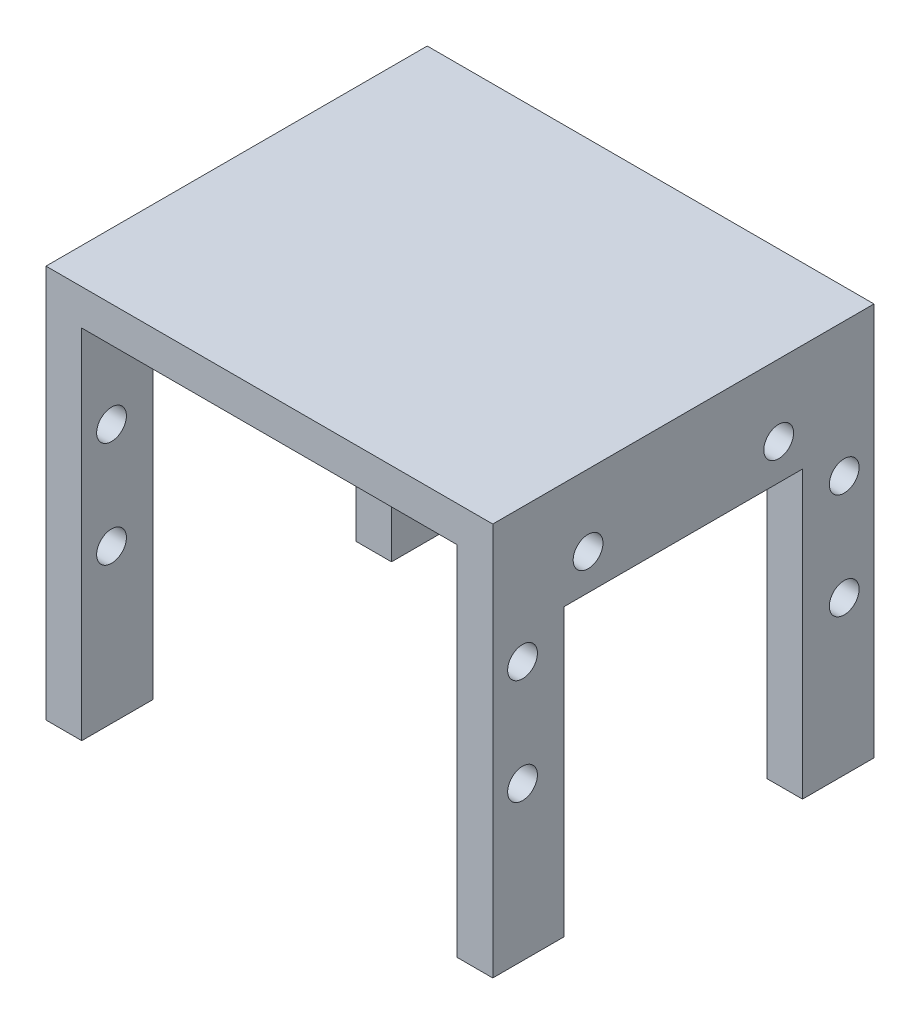
ISO-10303-21;
HEADER;
FILE_DESCRIPTION(('STEP AP214'),'2;1');
FILE_NAME('part.step','',(''),(''),'','','');
FILE_SCHEMA(('AUTOMOTIVE_DESIGN { 1 0 10303 214 1 1 1 1 }'));
ENDSEC;
DATA;
#1=APPLICATION_CONTEXT('core data for automotive mechanical design processes');
#2=APPLICATION_PROTOCOL_DEFINITION('international standard','automotive_design',2000,#1);
#3=PRODUCT_CONTEXT('',#1,'mechanical');
#4=PRODUCT('Part','Part','',(#3));
#5=PRODUCT_RELATED_PRODUCT_CATEGORY('part','',(#4));
#6=PRODUCT_DEFINITION_FORMATION('','',#4);
#7=PRODUCT_DEFINITION_CONTEXT('part definition',#1,'design');
#8=PRODUCT_DEFINITION('design','',#6,#7);
#9=PRODUCT_DEFINITION_SHAPE('','',#8);
#10=(LENGTH_UNIT() NAMED_UNIT(*) SI_UNIT(.MILLI.,.METRE.));
#11=(NAMED_UNIT(*) PLANE_ANGLE_UNIT() SI_UNIT($,.RADIAN.));
#12=(NAMED_UNIT(*) SI_UNIT($,.STERADIAN.) SOLID_ANGLE_UNIT());
#13=UNCERTAINTY_MEASURE_WITH_UNIT(LENGTH_MEASURE(1.E-05),#10,'distance_accuracy_value','');
#14=(GEOMETRIC_REPRESENTATION_CONTEXT(3) GLOBAL_UNCERTAINTY_ASSIGNED_CONTEXT((#13)) GLOBAL_UNIT_ASSIGNED_CONTEXT((#10,
#11,#12)) REPRESENTATION_CONTEXT('',''));
#15=CARTESIAN_POINT('',(0.,0.,0.));
#16=DIRECTION('',(0.,0.,1.));
#17=DIRECTION('',(1.,0.,0.));
#18=AXIS2_PLACEMENT_3D('',#15,#16,#17);
#19=CARTESIAN_POINT('',(-3.,0.,32.));
#20=DIRECTION('',(0.,1.,0.));
#21=DIRECTION('',(0.,0.,1.));
#22=AXIS2_PLACEMENT_3D('',#19,#20,#21);
#23=PLANE('',#22);
#24=DIRECTION('',(0.,0.,-1.));
#25=VECTOR('',#24,1.);
#26=CARTESIAN_POINT('',(-3.,0.,32.));
#27=LINE('',#26,#25);
#28=CARTESIAN_POINT('',(-3.,0.,32.));
#29=VERTEX_POINT('',#28);
#30=CARTESIAN_POINT('',(-3.,0.,26.));
#31=VERTEX_POINT('',#30);
#32=EDGE_CURVE('E236',#29,#31,#27,.T.);
#33=ORIENTED_EDGE('',*,*,#32,.T.);
#34=DIRECTION('',(1.,0.,0.));
#35=VECTOR('',#34,1.);
#36=CARTESIAN_POINT('',(-34.2409987036266,0.,26.));
#37=LINE('',#36,#35);
#38=CARTESIAN_POINT('',(0.,0.,26.));
#39=VERTEX_POINT('',#38);
#40=EDGE_CURVE('E169',#31,#39,#37,.T.);
#41=ORIENTED_EDGE('',*,*,#40,.T.);
#42=DIRECTION('',(0.,0.,-1.));
#43=VECTOR('',#42,1.);
#44=CARTESIAN_POINT('',(0.,0.,32.));
#45=LINE('',#44,#43);
#46=CARTESIAN_POINT('',(0.,0.,32.));
#47=VERTEX_POINT('',#46);
#48=EDGE_CURVE('E11',#47,#39,#45,.T.);
#49=ORIENTED_EDGE('',*,*,#48,.F.);
#50=DIRECTION('',(1.,0.,0.));
#51=VECTOR('',#50,1.);
#52=CARTESIAN_POINT('',(-3.,0.,32.));
#53=LINE('',#52,#51);
#54=EDGE_CURVE('E235',#29,#47,#53,.T.);
#55=ORIENTED_EDGE('',*,*,#54,.F.);
#56=EDGE_LOOP('',(#33,#41,#49,#55));
#57=FACE_BOUND('',#56,.T.);
#58=ADVANCED_FACE('F33',(#57),#23,.F.);
#59=CARTESIAN_POINT('',(31.5,0.,32.));
#60=DIRECTION('',(0.,1.,0.));
#61=DIRECTION('',(-1.,0.,0.));
#62=AXIS2_PLACEMENT_3D('',#59,#60,#61);
#63=PLANE('',#62);
#64=DIRECTION('',(0.,0.,-1.));
#65=VECTOR('',#64,1.);
#66=CARTESIAN_POINT('',(31.5,0.,32.));
#67=LINE('',#66,#65);
#68=CARTESIAN_POINT('',(31.5,0.,32.));
#69=VERTEX_POINT('',#68);
#70=CARTESIAN_POINT('',(31.5,0.,26.));
#71=VERTEX_POINT('',#70);
#72=EDGE_CURVE('E168',#69,#71,#67,.T.);
#73=ORIENTED_EDGE('',*,*,#72,.T.);
#74=CARTESIAN_POINT('',(34.5,0.,26.));
#75=VERTEX_POINT('',#74);
#76=EDGE_CURVE('E149',#71,#75,#37,.T.);
#77=ORIENTED_EDGE('',*,*,#76,.T.);
#78=DIRECTION('',(0.,0.,-1.));
#79=VECTOR('',#78,1.);
#80=CARTESIAN_POINT('',(34.5,0.,32.));
#81=LINE('',#80,#79);
#82=CARTESIAN_POINT('',(34.5,0.,32.));
#83=VERTEX_POINT('',#82);
#84=EDGE_CURVE('E165',#83,#75,#81,.T.);
#85=ORIENTED_EDGE('',*,*,#84,.F.);
#86=DIRECTION('',(1.,0.,0.));
#87=VECTOR('',#86,1.);
#88=CARTESIAN_POINT('',(31.5,0.,32.));
#89=LINE('',#88,#87);
#90=EDGE_CURVE('E258',#69,#83,#89,.T.);
#91=ORIENTED_EDGE('',*,*,#90,.F.);
#92=EDGE_LOOP('',(#73,#77,#85,#91));
#93=FACE_BOUND('',#92,.T.);
#94=ADVANCED_FACE('F163',(#93),#63,.F.);
#95=CARTESIAN_POINT('',(0.,0.,6.));
#96=VERTEX_POINT('',#95);
#97=CARTESIAN_POINT('',(0.,0.,0.));
#98=VERTEX_POINT('',#97);
#99=EDGE_CURVE('E41',#96,#98,#45,.T.);
#100=ORIENTED_EDGE('',*,*,#99,.F.);
#101=DIRECTION('',(1.,0.,0.));
#102=VECTOR('',#101,1.);
#103=CARTESIAN_POINT('',(-34.2409987036266,0.,6.));
#104=LINE('',#103,#102);
#105=CARTESIAN_POINT('',(-3.,0.,6.));
#106=VERTEX_POINT('',#105);
#107=EDGE_CURVE('E281',#106,#96,#104,.T.);
#108=ORIENTED_EDGE('',*,*,#107,.F.);
#109=CARTESIAN_POINT('',(-3.,0.,0.));
#110=VERTEX_POINT('',#109);
#111=EDGE_CURVE('E211',#106,#110,#27,.T.);
#112=ORIENTED_EDGE('',*,*,#111,.T.);
#113=DIRECTION('',(1.,0.,0.));
#114=VECTOR('',#113,1.);
#115=CARTESIAN_POINT('',(-3.,0.,0.));
#116=LINE('',#115,#114);
#117=EDGE_CURVE('E206',#110,#98,#116,.T.);
#118=ORIENTED_EDGE('',*,*,#117,.T.);
#119=EDGE_LOOP('',(#100,#108,#112,#118));
#120=FACE_BOUND('',#119,.T.);
#121=ADVANCED_FACE('F35',(#120),#23,.F.);
#122=CARTESIAN_POINT('',(0.,0.,32.));
#123=DIRECTION('',(-1.,0.,0.));
#124=DIRECTION('',(0.,0.,1.));
#125=AXIS2_PLACEMENT_3D('',#122,#123,#124);
#126=PLANE('',#125);
#127=CARTESIAN_POINT('',(0.,12.89624,29.5));
#128=DIRECTION('',(-1.,0.,0.));
#129=DIRECTION('',(0.,0.,1.));
#130=AXIS2_PLACEMENT_3D('',#127,#128,#129);
#131=CIRCLE('',#130,1.25);
#132=CARTESIAN_POINT('',(0.,12.89624,30.75));
#133=VERTEX_POINT('',#132);
#134=EDGE_CURVE('E353',#133,#133,#131,.T.);
#135=ORIENTED_EDGE('',*,*,#134,.T.);
#136=EDGE_LOOP('',(#135));
#137=FACE_BOUND('',#136,.T.);
#138=CARTESIAN_POINT('',(0.,21.75,29.5));
#139=DIRECTION('',(-1.,0.,0.));
#140=DIRECTION('',(0.,0.,1.));
#141=AXIS2_PLACEMENT_3D('',#138,#139,#140);
#142=CIRCLE('',#141,1.25);
#143=CARTESIAN_POINT('',(0.,21.75,30.75));
#144=VERTEX_POINT('',#143);
#145=EDGE_CURVE('E341',#144,#144,#142,.T.);
#146=ORIENTED_EDGE('',*,*,#145,.T.);
#147=EDGE_LOOP('',(#146));
#148=FACE_BOUND('',#147,.T.);
#149=CARTESIAN_POINT('',(0.,12.89624,2.5));
#150=DIRECTION('',(-1.,0.,0.));
#151=DIRECTION('',(0.,0.,1.));
#152=AXIS2_PLACEMENT_3D('',#149,#150,#151);
#153=CIRCLE('',#152,1.25);
#154=CARTESIAN_POINT('',(0.,12.89624,3.75));
#155=VERTEX_POINT('',#154);
#156=EDGE_CURVE('E329',#155,#155,#153,.T.);
#157=ORIENTED_EDGE('',*,*,#156,.T.);
#158=EDGE_LOOP('',(#157));
#159=FACE_BOUND('',#158,.T.);
#160=CARTESIAN_POINT('',(0.,21.75,2.5));
#161=DIRECTION('',(-1.,0.,0.));
#162=DIRECTION('',(0.,0.,1.));
#163=AXIS2_PLACEMENT_3D('',#160,#161,#162);
#164=CIRCLE('',#163,1.25);
#165=CARTESIAN_POINT('',(0.,21.75,3.75));
#166=VERTEX_POINT('',#165);
#167=EDGE_CURVE('E317',#166,#166,#164,.T.);
#168=ORIENTED_EDGE('',*,*,#167,.T.);
#169=EDGE_LOOP('',(#168));
#170=FACE_BOUND('',#169,.T.);
#171=CARTESIAN_POINT('',(0.,27.,8.));
#172=DIRECTION('',(-1.,0.,0.));
#173=DIRECTION('',(0.,0.,1.));
#174=AXIS2_PLACEMENT_3D('',#171,#172,#173);
#175=CIRCLE('',#174,1.25);
#176=CARTESIAN_POINT('',(0.,27.,9.25));
#177=VERTEX_POINT('',#176);
#178=EDGE_CURVE('E305',#177,#177,#175,.T.);
#179=ORIENTED_EDGE('',*,*,#178,.T.);
#180=EDGE_LOOP('',(#179));
#181=FACE_BOUND('',#180,.T.);
#182=CARTESIAN_POINT('',(0.,27.,24.));
#183=DIRECTION('',(-1.,0.,0.));
#184=DIRECTION('',(0.,0.,1.));
#185=AXIS2_PLACEMENT_3D('',#182,#183,#184);
#186=CIRCLE('',#185,1.25);
#187=CARTESIAN_POINT('',(0.,27.,25.25));
#188=VERTEX_POINT('',#187);
#189=EDGE_CURVE('E158',#188,#188,#186,.T.);
#190=ORIENTED_EDGE('',*,*,#189,.T.);
#191=EDGE_LOOP('',(#190));
#192=FACE_BOUND('',#191,.T.);
#193=ORIENTED_EDGE('',*,*,#48,.T.);
#194=DIRECTION('',(0.,1.,0.));
#195=VECTOR('',#194,1.);
#196=CARTESIAN_POINT('',(0.,0.,26.));
#197=LINE('',#196,#195);
#198=CARTESIAN_POINT('',(0.,24.,26.));
#199=VERTEX_POINT('',#198);
#200=EDGE_CURVE('E213',#39,#199,#197,.T.);
#201=ORIENTED_EDGE('',*,*,#200,.T.);
#202=DIRECTION('',(0.,0.,-1.));
#203=VECTOR('',#202,1.);
#204=CARTESIAN_POINT('',(0.,24.,32.));
#205=LINE('',#204,#203);
#206=CARTESIAN_POINT('',(0.,24.,6.));
#207=VERTEX_POINT('',#206);
#208=EDGE_CURVE('E270',#199,#207,#205,.T.);
#209=ORIENTED_EDGE('',*,*,#208,.T.);
#210=DIRECTION('',(0.,-1.,0.));
#211=VECTOR('',#210,1.);
#212=CARTESIAN_POINT('',(0.,0.,6.));
#213=LINE('',#212,#211);
#214=EDGE_CURVE('E198',#207,#96,#213,.T.);
#215=ORIENTED_EDGE('',*,*,#214,.T.);
#216=ORIENTED_EDGE('',*,*,#99,.T.);
#217=DIRECTION('',(0.,1.,0.));
#218=VECTOR('',#217,1.);
#219=CARTESIAN_POINT('',(0.,0.,0.));
#220=LINE('',#219,#218);
#221=CARTESIAN_POINT('',(0.,30.,0.));
#222=VERTEX_POINT('',#221);
#223=EDGE_CURVE('E196',#98,#222,#220,.T.);
#224=ORIENTED_EDGE('',*,*,#223,.T.);
#225=DIRECTION('',(0.,0.,-1.));
#226=VECTOR('',#225,1.);
#227=CARTESIAN_POINT('',(0.,30.,32.));
#228=LINE('',#227,#226);
#229=CARTESIAN_POINT('',(0.,30.,32.));
#230=VERTEX_POINT('',#229);
#231=EDGE_CURVE('E185',#230,#222,#228,.T.);
#232=ORIENTED_EDGE('',*,*,#231,.F.);
#233=DIRECTION('',(0.,1.,0.));
#234=VECTOR('',#233,1.);
#235=CARTESIAN_POINT('',(0.,0.,32.));
#236=LINE('',#235,#234);
#237=EDGE_CURVE('E266',#47,#230,#236,.T.);
#238=ORIENTED_EDGE('',*,*,#237,.F.);
#239=EDGE_LOOP('',(#193,#201,#209,#215,#216,#224,#232,#238));
#240=FACE_BOUND('',#239,.T.);
#241=ADVANCED_FACE('F195',(#137,#148,#159,#170,#181,#192,#240),#126,.F.);
#242=CARTESIAN_POINT('',(0.,30.,32.));
#243=DIRECTION('',(0.,1.,0.));
#244=DIRECTION('',(0.,0.,1.));
#245=AXIS2_PLACEMENT_3D('',#242,#243,#244);
#246=PLANE('',#245);
#247=DIRECTION('',(1.,0.,0.));
#248=VECTOR('',#247,1.);
#249=CARTESIAN_POINT('',(0.,30.,0.));
#250=LINE('',#249,#248);
#251=CARTESIAN_POINT('',(31.5,30.,0.));
#252=VERTEX_POINT('',#251);
#253=EDGE_CURVE('E208',#222,#252,#250,.T.);
#254=ORIENTED_EDGE('',*,*,#253,.T.);
#255=DIRECTION('',(0.,0.,-1.));
#256=VECTOR('',#255,1.);
#257=CARTESIAN_POINT('',(31.5,30.,32.));
#258=LINE('',#257,#256);
#259=CARTESIAN_POINT('',(31.5,30.,32.));
#260=VERTEX_POINT('',#259);
#261=EDGE_CURVE('E183',#260,#252,#258,.T.);
#262=ORIENTED_EDGE('',*,*,#261,.F.);
#263=DIRECTION('',(1.,0.,0.));
#264=VECTOR('',#263,1.);
#265=CARTESIAN_POINT('',(0.,30.,32.));
#266=LINE('',#265,#264);
#267=EDGE_CURVE('E264',#230,#260,#266,.T.);
#268=ORIENTED_EDGE('',*,*,#267,.F.);
#269=ORIENTED_EDGE('',*,*,#231,.T.);
#270=EDGE_LOOP('',(#254,#262,#268,#269));
#271=FACE_BOUND('',#270,.T.);
#272=ADVANCED_FACE('F394',(#271),#246,.F.);
#273=CARTESIAN_POINT('',(31.5,30.,32.));
#274=DIRECTION('',(1.,0.,0.));
#275=DIRECTION('',(0.,0.,-1.));
#276=AXIS2_PLACEMENT_3D('',#273,#274,#275);
#277=PLANE('',#276);
#278=CARTESIAN_POINT('',(31.5,12.89624,29.5));
#279=DIRECTION('',(1.,0.,0.));
#280=DIRECTION('',(0.,0.,-1.));
#281=AXIS2_PLACEMENT_3D('',#278,#279,#280);
#282=CIRCLE('',#281,1.25);
#283=CARTESIAN_POINT('',(31.5,12.89624,28.25));
#284=VERTEX_POINT('',#283);
#285=EDGE_CURVE('E356',#284,#284,#282,.T.);
#286=ORIENTED_EDGE('',*,*,#285,.T.);
#287=EDGE_LOOP('',(#286));
#288=FACE_BOUND('',#287,.T.);
#289=CARTESIAN_POINT('',(31.5,21.75,29.5));
#290=DIRECTION('',(1.,0.,0.));
#291=DIRECTION('',(0.,0.,-1.));
#292=AXIS2_PLACEMENT_3D('',#289,#290,#291);
#293=CIRCLE('',#292,1.25);
#294=CARTESIAN_POINT('',(31.5,21.75,28.25));
#295=VERTEX_POINT('',#294);
#296=EDGE_CURVE('E344',#295,#295,#293,.T.);
#297=ORIENTED_EDGE('',*,*,#296,.T.);
#298=EDGE_LOOP('',(#297));
#299=FACE_BOUND('',#298,.T.);
#300=CARTESIAN_POINT('',(31.5,12.89624,2.5));
#301=DIRECTION('',(1.,0.,0.));
#302=DIRECTION('',(0.,0.,-1.));
#303=AXIS2_PLACEMENT_3D('',#300,#301,#302);
#304=CIRCLE('',#303,1.25);
#305=CARTESIAN_POINT('',(31.5,12.89624,1.25));
#306=VERTEX_POINT('',#305);
#307=EDGE_CURVE('E332',#306,#306,#304,.T.);
#308=ORIENTED_EDGE('',*,*,#307,.T.);
#309=EDGE_LOOP('',(#308));
#310=FACE_BOUND('',#309,.T.);
#311=CARTESIAN_POINT('',(31.5,21.75,2.5));
#312=DIRECTION('',(1.,0.,0.));
#313=DIRECTION('',(0.,0.,-1.));
#314=AXIS2_PLACEMENT_3D('',#311,#312,#313);
#315=CIRCLE('',#314,1.25);
#316=CARTESIAN_POINT('',(31.5,21.75,1.25));
#317=VERTEX_POINT('',#316);
#318=EDGE_CURVE('E320',#317,#317,#315,.T.);
#319=ORIENTED_EDGE('',*,*,#318,.T.);
#320=EDGE_LOOP('',(#319));
#321=FACE_BOUND('',#320,.T.);
#322=CARTESIAN_POINT('',(31.5,27.,8.));
#323=DIRECTION('',(1.,0.,0.));
#324=DIRECTION('',(0.,0.,-1.));
#325=AXIS2_PLACEMENT_3D('',#322,#323,#324);
#326=CIRCLE('',#325,1.25);
#327=CARTESIAN_POINT('',(31.5,27.,6.75));
#328=VERTEX_POINT('',#327);
#329=EDGE_CURVE('E308',#328,#328,#326,.T.);
#330=ORIENTED_EDGE('',*,*,#329,.T.);
#331=EDGE_LOOP('',(#330));
#332=FACE_BOUND('',#331,.T.);
#333=CARTESIAN_POINT('',(31.5,27.,24.));
#334=DIRECTION('',(1.,0.,0.));
#335=DIRECTION('',(0.,0.,-1.));
#336=AXIS2_PLACEMENT_3D('',#333,#334,#335);
#337=CIRCLE('',#336,1.25);
#338=CARTESIAN_POINT('',(31.5,27.,22.75));
#339=VERTEX_POINT('',#338);
#340=EDGE_CURVE('E296',#339,#339,#337,.T.);
#341=ORIENTED_EDGE('',*,*,#340,.T.);
#342=EDGE_LOOP('',(#341));
#343=FACE_BOUND('',#342,.T.);
#344=DIRECTION('',(0.,0.,1.));
#345=VECTOR('',#344,1.);
#346=CARTESIAN_POINT('',(31.5,24.,32.));
#347=LINE('',#346,#345);
#348=CARTESIAN_POINT('',(31.5,24.,6.));
#349=VERTEX_POINT('',#348);
#350=CARTESIAN_POINT('',(31.5,24.,26.));
#351=VERTEX_POINT('',#350);
#352=EDGE_CURVE('E272',#349,#351,#347,.T.);
#353=ORIENTED_EDGE('',*,*,#352,.T.);
#354=DIRECTION('',(0.,-1.,0.));
#355=VECTOR('',#354,1.);
#356=CARTESIAN_POINT('',(31.5,30.,26.));
#357=LINE('',#356,#355);
#358=EDGE_CURVE('E216',#351,#71,#357,.T.);
#359=ORIENTED_EDGE('',*,*,#358,.T.);
#360=ORIENTED_EDGE('',*,*,#72,.F.);
#361=DIRECTION('',(0.,-1.,0.));
#362=VECTOR('',#361,1.);
#363=CARTESIAN_POINT('',(31.5,30.,32.));
#364=LINE('',#363,#362);
#365=EDGE_CURVE('E262',#260,#69,#364,.T.);
#366=ORIENTED_EDGE('',*,*,#365,.F.);
#367=ORIENTED_EDGE('',*,*,#261,.T.);
#368=DIRECTION('',(0.,-1.,0.));
#369=VECTOR('',#368,1.);
#370=CARTESIAN_POINT('',(31.5,30.,0.));
#371=LINE('',#370,#369);
#372=CARTESIAN_POINT('',(31.5,0.,0.));
#373=VERTEX_POINT('',#372);
#374=EDGE_CURVE('E223',#252,#373,#371,.T.);
#375=ORIENTED_EDGE('',*,*,#374,.T.);
#376=CARTESIAN_POINT('',(31.5,0.,6.));
#377=VERTEX_POINT('',#376);
#378=EDGE_CURVE('E175',#377,#373,#67,.T.);
#379=ORIENTED_EDGE('',*,*,#378,.F.);
#380=DIRECTION('',(0.,1.,0.));
#381=VECTOR('',#380,1.);
#382=CARTESIAN_POINT('',(31.5,30.,6.));
#383=LINE('',#382,#381);
#384=EDGE_CURVE('E276',#377,#349,#383,.T.);
#385=ORIENTED_EDGE('',*,*,#384,.T.);
#386=EDGE_LOOP('',(#353,#359,#360,#366,#367,#375,#379,#385));
#387=FACE_BOUND('',#386,.T.);
#388=ADVANCED_FACE('F391',(#288,#299,#310,#321,#332,#343,#387),#277,.F.);
#389=CARTESIAN_POINT('',(34.5,0.,6.00000000000001));
#390=VERTEX_POINT('',#389);
#391=CARTESIAN_POINT('',(34.5,0.,0.));
#392=VERTEX_POINT('',#391);
#393=EDGE_CURVE('E176',#390,#392,#81,.T.);
#394=ORIENTED_EDGE('',*,*,#393,.F.);
#395=EDGE_CURVE('E48',#377,#390,#104,.T.);
#396=ORIENTED_EDGE('',*,*,#395,.F.);
#397=ORIENTED_EDGE('',*,*,#378,.T.);
#398=DIRECTION('',(1.,0.,0.));
#399=VECTOR('',#398,1.);
#400=CARTESIAN_POINT('',(31.5,0.,0.));
#401=LINE('',#400,#399);
#402=EDGE_CURVE('E226',#373,#392,#401,.T.);
#403=ORIENTED_EDGE('',*,*,#402,.T.);
#404=EDGE_LOOP('',(#394,#396,#397,#403));
#405=FACE_BOUND('',#404,.T.);
#406=ADVANCED_FACE('F371',(#405),#63,.F.);
#407=CARTESIAN_POINT('',(34.5,33.,32.));
#408=DIRECTION('',(-1.,0.,0.));
#409=DIRECTION('',(0.,0.,1.));
#410=AXIS2_PLACEMENT_3D('',#407,#408,#409);
#411=PLANE('',#410);
#412=CARTESIAN_POINT('',(34.5,12.89624,29.5));
#413=DIRECTION('',(1.,0.,0.));
#414=DIRECTION('',(0.,0.,-1.));
#415=AXIS2_PLACEMENT_3D('',#412,#413,#414);
#416=CIRCLE('',#415,1.25);
#417=CARTESIAN_POINT('',(34.5,12.89624,28.25));
#418=VERTEX_POINT('',#417);
#419=EDGE_CURVE('E362',#418,#418,#416,.T.);
#420=ORIENTED_EDGE('',*,*,#419,.F.);
#421=EDGE_LOOP('',(#420));
#422=FACE_BOUND('',#421,.T.);
#423=CARTESIAN_POINT('',(34.5,21.75,29.5));
#424=DIRECTION('',(1.,0.,0.));
#425=DIRECTION('',(0.,0.,-1.));
#426=AXIS2_PLACEMENT_3D('',#423,#424,#425);
#427=CIRCLE('',#426,1.25);
#428=CARTESIAN_POINT('',(34.5,21.75,28.25));
#429=VERTEX_POINT('',#428);
#430=EDGE_CURVE('E350',#429,#429,#427,.T.);
#431=ORIENTED_EDGE('',*,*,#430,.F.);
#432=EDGE_LOOP('',(#431));
#433=FACE_BOUND('',#432,.T.);
#434=CARTESIAN_POINT('',(34.5,12.89624,2.5));
#435=DIRECTION('',(1.,0.,0.));
#436=DIRECTION('',(0.,0.,-1.));
#437=AXIS2_PLACEMENT_3D('',#434,#435,#436);
#438=CIRCLE('',#437,1.25);
#439=CARTESIAN_POINT('',(34.5,12.89624,1.25));
#440=VERTEX_POINT('',#439);
#441=EDGE_CURVE('E338',#440,#440,#438,.T.);
#442=ORIENTED_EDGE('',*,*,#441,.F.);
#443=EDGE_LOOP('',(#442));
#444=FACE_BOUND('',#443,.T.);
#445=CARTESIAN_POINT('',(34.5,21.75,2.5));
#446=DIRECTION('',(1.,0.,0.));
#447=DIRECTION('',(0.,0.,-1.));
#448=AXIS2_PLACEMENT_3D('',#445,#446,#447);
#449=CIRCLE('',#448,1.25);
#450=CARTESIAN_POINT('',(34.5,21.75,1.25));
#451=VERTEX_POINT('',#450);
#452=EDGE_CURVE('E326',#451,#451,#449,.T.);
#453=ORIENTED_EDGE('',*,*,#452,.F.);
#454=EDGE_LOOP('',(#453));
#455=FACE_BOUND('',#454,.T.);
#456=CARTESIAN_POINT('',(34.5,27.,8.));
#457=DIRECTION('',(1.,0.,0.));
#458=DIRECTION('',(0.,0.,-1.));
#459=AXIS2_PLACEMENT_3D('',#456,#457,#458);
#460=CIRCLE('',#459,1.25);
#461=CARTESIAN_POINT('',(34.5,27.,6.75));
#462=VERTEX_POINT('',#461);
#463=EDGE_CURVE('E314',#462,#462,#460,.T.);
#464=ORIENTED_EDGE('',*,*,#463,.F.);
#465=EDGE_LOOP('',(#464));
#466=FACE_BOUND('',#465,.T.);
#467=CARTESIAN_POINT('',(34.5,27.,24.));
#468=DIRECTION('',(1.,0.,0.));
#469=DIRECTION('',(0.,0.,-1.));
#470=AXIS2_PLACEMENT_3D('',#467,#468,#469);
#471=CIRCLE('',#470,1.25);
#472=CARTESIAN_POINT('',(34.5,27.,22.75));
#473=VERTEX_POINT('',#472);
#474=EDGE_CURVE('E302',#473,#473,#471,.T.);
#475=ORIENTED_EDGE('',*,*,#474,.F.);
#476=EDGE_LOOP('',(#475));
#477=FACE_BOUND('',#476,.T.);
#478=ORIENTED_EDGE('',*,*,#84,.T.);
#479=DIRECTION('',(0.,-1.,0.));
#480=VECTOR('',#479,1.);
#481=CARTESIAN_POINT('',(34.5,0.,26.));
#482=LINE('',#481,#480);
#483=CARTESIAN_POINT('',(34.5,24.,26.));
#484=VERTEX_POINT('',#483);
#485=EDGE_CURVE('E146',#484,#75,#482,.T.);
#486=ORIENTED_EDGE('',*,*,#485,.F.);
#487=DIRECTION('',(0.,0.,1.));
#488=VECTOR('',#487,1.);
#489=CARTESIAN_POINT('',(34.5,24.,26.));
#490=LINE('',#489,#488);
#491=CARTESIAN_POINT('',(34.5,24.,6.));
#492=VERTEX_POINT('',#491);
#493=EDGE_CURVE('E170',#492,#484,#490,.T.);
#494=ORIENTED_EDGE('',*,*,#493,.F.);
#495=DIRECTION('',(0.,1.,0.));
#496=VECTOR('',#495,1.);
#497=CARTESIAN_POINT('',(34.5,0.,6.));
#498=LINE('',#497,#496);
#499=EDGE_CURVE('E157',#390,#492,#498,.T.);
#500=ORIENTED_EDGE('',*,*,#499,.F.);
#501=ORIENTED_EDGE('',*,*,#393,.T.);
#502=DIRECTION('',(0.,1.,0.));
#503=VECTOR('',#502,1.);
#504=CARTESIAN_POINT('',(34.5,33.,0.));
#505=LINE('',#504,#503);
#506=CARTESIAN_POINT('',(34.5,33.,0.));
#507=VERTEX_POINT('',#506);
#508=EDGE_CURVE('E229',#392,#507,#505,.T.);
#509=ORIENTED_EDGE('',*,*,#508,.T.);
#510=DIRECTION('',(0.,0.,-1.));
#511=VECTOR('',#510,1.);
#512=CARTESIAN_POINT('',(34.5,33.,32.));
#513=LINE('',#512,#511);
#514=CARTESIAN_POINT('',(34.5,33.,32.));
#515=VERTEX_POINT('',#514);
#516=EDGE_CURVE('E179',#515,#507,#513,.T.);
#517=ORIENTED_EDGE('',*,*,#516,.F.);
#518=DIRECTION('',(0.,1.,0.));
#519=VECTOR('',#518,1.);
#520=CARTESIAN_POINT('',(34.5,33.,32.));
#521=LINE('',#520,#519);
#522=EDGE_CURVE('E174',#83,#515,#521,.T.);
#523=ORIENTED_EDGE('',*,*,#522,.F.);
#524=EDGE_LOOP('',(#478,#486,#494,#500,#501,#509,#517,#523));
#525=FACE_BOUND('',#524,.T.);
#526=ADVANCED_FACE('F172',(#422,#433,#444,#455,#466,#477,#525),#411,.F.);
#527=CARTESIAN_POINT('',(-3.,33.,32.));
#528=DIRECTION('',(0.,-1.,0.));
#529=DIRECTION('',(0.,0.,-1.));
#530=AXIS2_PLACEMENT_3D('',#527,#528,#529);
#531=PLANE('',#530);
#532=DIRECTION('',(-1.,0.,0.));
#533=VECTOR('',#532,1.);
#534=CARTESIAN_POINT('',(-3.,33.,0.));
#535=LINE('',#534,#533);
#536=CARTESIAN_POINT('',(-3.,33.,0.));
#537=VERTEX_POINT('',#536);
#538=EDGE_CURVE('E231',#507,#537,#535,.T.);
#539=ORIENTED_EDGE('',*,*,#538,.T.);
#540=DIRECTION('',(0.,0.,-1.));
#541=VECTOR('',#540,1.);
#542=CARTESIAN_POINT('',(-3.,33.,32.));
#543=LINE('',#542,#541);
#544=CARTESIAN_POINT('',(-3.,33.,32.));
#545=VERTEX_POINT('',#544);
#546=EDGE_CURVE('E238',#545,#537,#543,.T.);
#547=ORIENTED_EDGE('',*,*,#546,.F.);
#548=DIRECTION('',(-1.,0.,0.));
#549=VECTOR('',#548,1.);
#550=CARTESIAN_POINT('',(-3.,33.,32.));
#551=LINE('',#550,#549);
#552=EDGE_CURVE('E248',#515,#545,#551,.T.);
#553=ORIENTED_EDGE('',*,*,#552,.F.);
#554=ORIENTED_EDGE('',*,*,#516,.T.);
#555=EDGE_LOOP('',(#539,#547,#553,#554));
#556=FACE_BOUND('',#555,.T.);
#557=ADVANCED_FACE('F247',(#556),#531,.F.);
#558=CARTESIAN_POINT('',(-3.,0.,32.));
#559=DIRECTION('',(1.,0.,0.));
#560=DIRECTION('',(0.,0.,-1.));
#561=AXIS2_PLACEMENT_3D('',#558,#559,#560);
#562=PLANE('',#561);
#563=CARTESIAN_POINT('',(-3.,12.89624,29.5));
#564=DIRECTION('',(1.,0.,0.));
#565=DIRECTION('',(0.,0.,-1.));
#566=AXIS2_PLACEMENT_3D('',#563,#564,#565);
#567=CIRCLE('',#566,1.25);
#568=CARTESIAN_POINT('',(-3.,12.89624,28.25));
#569=VERTEX_POINT('',#568);
#570=EDGE_CURVE('E359',#569,#569,#567,.F.);
#571=ORIENTED_EDGE('',*,*,#570,.F.);
#572=EDGE_LOOP('',(#571));
#573=FACE_BOUND('',#572,.T.);
#574=CARTESIAN_POINT('',(-3.,21.75,29.5));
#575=DIRECTION('',(1.,0.,0.));
#576=DIRECTION('',(0.,0.,-1.));
#577=AXIS2_PLACEMENT_3D('',#574,#575,#576);
#578=CIRCLE('',#577,1.25);
#579=CARTESIAN_POINT('',(-3.,21.75,28.25));
#580=VERTEX_POINT('',#579);
#581=EDGE_CURVE('E347',#580,#580,#578,.F.);
#582=ORIENTED_EDGE('',*,*,#581,.F.);
#583=EDGE_LOOP('',(#582));
#584=FACE_BOUND('',#583,.T.);
#585=CARTESIAN_POINT('',(-3.,12.89624,2.5));
#586=DIRECTION('',(1.,0.,0.));
#587=DIRECTION('',(0.,0.,-1.));
#588=AXIS2_PLACEMENT_3D('',#585,#586,#587);
#589=CIRCLE('',#588,1.25);
#590=CARTESIAN_POINT('',(-3.,12.89624,1.25));
#591=VERTEX_POINT('',#590);
#592=EDGE_CURVE('E335',#591,#591,#589,.F.);
#593=ORIENTED_EDGE('',*,*,#592,.F.);
#594=EDGE_LOOP('',(#593));
#595=FACE_BOUND('',#594,.T.);
#596=CARTESIAN_POINT('',(-3.,21.75,2.5));
#597=DIRECTION('',(1.,0.,0.));
#598=DIRECTION('',(0.,0.,-1.));
#599=AXIS2_PLACEMENT_3D('',#596,#597,#598);
#600=CIRCLE('',#599,1.25);
#601=CARTESIAN_POINT('',(-3.,21.75,1.25));
#602=VERTEX_POINT('',#601);
#603=EDGE_CURVE('E323',#602,#602,#600,.F.);
#604=ORIENTED_EDGE('',*,*,#603,.F.);
#605=EDGE_LOOP('',(#604));
#606=FACE_BOUND('',#605,.T.);
#607=CARTESIAN_POINT('',(-3.,27.,8.));
#608=DIRECTION('',(1.,0.,0.));
#609=DIRECTION('',(0.,0.,-1.));
#610=AXIS2_PLACEMENT_3D('',#607,#608,#609);
#611=CIRCLE('',#610,1.25);
#612=CARTESIAN_POINT('',(-3.,27.,6.75));
#613=VERTEX_POINT('',#612);
#614=EDGE_CURVE('E311',#613,#613,#611,.F.);
#615=ORIENTED_EDGE('',*,*,#614,.F.);
#616=EDGE_LOOP('',(#615));
#617=FACE_BOUND('',#616,.T.);
#618=CARTESIAN_POINT('',(-3.,27.,24.));
#619=DIRECTION('',(1.,0.,0.));
#620=DIRECTION('',(0.,0.,-1.));
#621=AXIS2_PLACEMENT_3D('',#618,#619,#620);
#622=CIRCLE('',#621,1.25);
#623=CARTESIAN_POINT('',(-3.,27.,22.75));
#624=VERTEX_POINT('',#623);
#625=EDGE_CURVE('E299',#624,#624,#622,.F.);
#626=ORIENTED_EDGE('',*,*,#625,.F.);
#627=EDGE_LOOP('',(#626));
#628=FACE_BOUND('',#627,.T.);
#629=DIRECTION('',(0.,0.,-1.));
#630=VECTOR('',#629,1.);
#631=CARTESIAN_POINT('',(-3.,24.,26.));
#632=LINE('',#631,#630);
#633=CARTESIAN_POINT('',(-3.,24.,26.));
#634=VERTEX_POINT('',#633);
#635=CARTESIAN_POINT('',(-3.,24.,6.));
#636=VERTEX_POINT('',#635);
#637=EDGE_CURVE('E291',#634,#636,#632,.T.);
#638=ORIENTED_EDGE('',*,*,#637,.F.);
#639=DIRECTION('',(0.,1.,0.));
#640=VECTOR('',#639,1.);
#641=CARTESIAN_POINT('',(-3.,0.,26.));
#642=LINE('',#641,#640);
#643=EDGE_CURVE('E278',#31,#634,#642,.T.);
#644=ORIENTED_EDGE('',*,*,#643,.F.);
#645=ORIENTED_EDGE('',*,*,#32,.F.);
#646=DIRECTION('',(0.,-1.,0.));
#647=VECTOR('',#646,1.);
#648=CARTESIAN_POINT('',(-3.,0.,32.));
#649=LINE('',#648,#647);
#650=EDGE_CURVE('E219',#545,#29,#649,.T.);
#651=ORIENTED_EDGE('',*,*,#650,.F.);
#652=ORIENTED_EDGE('',*,*,#546,.T.);
#653=DIRECTION('',(0.,-1.,0.));
#654=VECTOR('',#653,1.);
#655=CARTESIAN_POINT('',(-3.,0.,0.));
#656=LINE('',#655,#654);
#657=EDGE_CURVE('E233',#537,#110,#656,.T.);
#658=ORIENTED_EDGE('',*,*,#657,.T.);
#659=ORIENTED_EDGE('',*,*,#111,.F.);
#660=DIRECTION('',(0.,-1.,0.));
#661=VECTOR('',#660,1.);
#662=CARTESIAN_POINT('',(-3.,0.,6.));
#663=LINE('',#662,#661);
#664=EDGE_CURVE('E254',#636,#106,#663,.T.);
#665=ORIENTED_EDGE('',*,*,#664,.F.);
#666=EDGE_LOOP('',(#638,#644,#645,#651,#652,#658,#659,#665));
#667=FACE_BOUND('',#666,.T.);
#668=ADVANCED_FACE('F252',(#573,#584,#595,#606,#617,#628,#667),#562,.F.);
#669=CARTESIAN_POINT('',(0.,0.,32.));
#670=DIRECTION('',(0.,0.,1.));
#671=DIRECTION('',(1.,0.,0.));
#672=AXIS2_PLACEMENT_3D('',#669,#670,#671);
#673=PLANE('',#672);
#674=ORIENTED_EDGE('',*,*,#54,.T.);
#675=ORIENTED_EDGE('',*,*,#237,.T.);
#676=ORIENTED_EDGE('',*,*,#267,.T.);
#677=ORIENTED_EDGE('',*,*,#365,.T.);
#678=ORIENTED_EDGE('',*,*,#90,.T.);
#679=ORIENTED_EDGE('',*,*,#522,.T.);
#680=ORIENTED_EDGE('',*,*,#552,.T.);
#681=ORIENTED_EDGE('',*,*,#650,.T.);
#682=EDGE_LOOP('',(#674,#675,#676,#677,#678,#679,#680,#681));
#683=FACE_BOUND('',#682,.T.);
#684=ADVANCED_FACE('F406',(#683),#673,.T.);
#685=CARTESIAN_POINT('',(0.,0.,0.));
#686=DIRECTION('',(0.,0.,1.));
#687=DIRECTION('',(1.,0.,0.));
#688=AXIS2_PLACEMENT_3D('',#685,#686,#687);
#689=PLANE('',#688);
#690=ORIENTED_EDGE('',*,*,#117,.F.);
#691=ORIENTED_EDGE('',*,*,#657,.F.);
#692=ORIENTED_EDGE('',*,*,#538,.F.);
#693=ORIENTED_EDGE('',*,*,#508,.F.);
#694=ORIENTED_EDGE('',*,*,#402,.F.);
#695=ORIENTED_EDGE('',*,*,#374,.F.);
#696=ORIENTED_EDGE('',*,*,#253,.F.);
#697=ORIENTED_EDGE('',*,*,#223,.F.);
#698=EDGE_LOOP('',(#690,#691,#692,#693,#694,#695,#696,#697));
#699=FACE_BOUND('',#698,.T.);
#700=ADVANCED_FACE('F204',(#699),#689,.F.);
#701=CARTESIAN_POINT('',(-34.2409987036266,0.,6.));
#702=DIRECTION('',(0.,0.,-1.));
#703=DIRECTION('',(-1.,0.,0.));
#704=AXIS2_PLACEMENT_3D('',#701,#702,#703);
#705=PLANE('',#704);
#706=DIRECTION('',(1.,0.,0.));
#707=VECTOR('',#706,1.);
#708=CARTESIAN_POINT('',(-34.2409987036266,24.,6.));
#709=LINE('',#708,#707);
#710=EDGE_CURVE('E56',#636,#207,#709,.T.);
#711=ORIENTED_EDGE('',*,*,#710,.F.);
#712=ORIENTED_EDGE('',*,*,#664,.T.);
#713=ORIENTED_EDGE('',*,*,#107,.T.);
#714=ORIENTED_EDGE('',*,*,#214,.F.);
#715=EDGE_LOOP('',(#711,#712,#713,#714));
#716=FACE_BOUND('',#715,.T.);
#717=ADVANCED_FACE('F417',(#716),#705,.F.);
#718=CARTESIAN_POINT('',(-34.2409987036266,24.,26.));
#719=DIRECTION('',(0.,1.,0.));
#720=DIRECTION('',(0.,0.,1.));
#721=AXIS2_PLACEMENT_3D('',#718,#719,#720);
#722=PLANE('',#721);
#723=DIRECTION('',(1.,0.,0.));
#724=VECTOR('',#723,1.);
#725=CARTESIAN_POINT('',(-34.2409987036266,24.,26.));
#726=LINE('',#725,#724);
#727=EDGE_CURVE('E285',#634,#199,#726,.T.);
#728=ORIENTED_EDGE('',*,*,#727,.F.);
#729=ORIENTED_EDGE('',*,*,#637,.T.);
#730=ORIENTED_EDGE('',*,*,#710,.T.);
#731=ORIENTED_EDGE('',*,*,#208,.F.);
#732=EDGE_LOOP('',(#728,#729,#730,#731));
#733=FACE_BOUND('',#732,.T.);
#734=ADVANCED_FACE('F415',(#733),#722,.F.);
#735=CARTESIAN_POINT('',(-34.2409987036266,0.,26.));
#736=DIRECTION('',(0.,0.,1.));
#737=DIRECTION('',(1.,0.,0.));
#738=AXIS2_PLACEMENT_3D('',#735,#736,#737);
#739=PLANE('',#738);
#740=ORIENTED_EDGE('',*,*,#40,.F.);
#741=ORIENTED_EDGE('',*,*,#643,.T.);
#742=ORIENTED_EDGE('',*,*,#727,.T.);
#743=ORIENTED_EDGE('',*,*,#200,.F.);
#744=EDGE_LOOP('',(#740,#741,#742,#743));
#745=FACE_BOUND('',#744,.T.);
#746=ADVANCED_FACE('F412',(#745),#739,.F.);
#747=EDGE_CURVE('E152',#351,#484,#726,.T.);
#748=ORIENTED_EDGE('',*,*,#747,.T.);
#749=ORIENTED_EDGE('',*,*,#485,.T.);
#750=ORIENTED_EDGE('',*,*,#76,.F.);
#751=ORIENTED_EDGE('',*,*,#358,.F.);
#752=EDGE_LOOP('',(#748,#749,#750,#751));
#753=FACE_BOUND('',#752,.T.);
#754=ADVANCED_FACE('F148',(#753),#739,.F.);
#755=EDGE_CURVE('E283',#349,#492,#709,.T.);
#756=ORIENTED_EDGE('',*,*,#755,.T.);
#757=ORIENTED_EDGE('',*,*,#493,.T.);
#758=ORIENTED_EDGE('',*,*,#747,.F.);
#759=ORIENTED_EDGE('',*,*,#352,.F.);
#760=EDGE_LOOP('',(#756,#757,#758,#759));
#761=FACE_BOUND('',#760,.T.);
#762=ADVANCED_FACE('F400',(#761),#722,.F.);
#763=ORIENTED_EDGE('',*,*,#395,.T.);
#764=ORIENTED_EDGE('',*,*,#499,.T.);
#765=ORIENTED_EDGE('',*,*,#755,.F.);
#766=ORIENTED_EDGE('',*,*,#384,.F.);
#767=EDGE_LOOP('',(#763,#764,#765,#766));
#768=FACE_BOUND('',#767,.T.);
#769=ADVANCED_FACE('F401',(#768),#705,.F.);
#770=CARTESIAN_POINT('',(-6.53553390593274,27.,24.));
#771=DIRECTION('',(1.,0.,0.));
#772=DIRECTION('',(0.,0.,-1.));
#773=AXIS2_PLACEMENT_3D('',#770,#771,#772);
#774=CYLINDRICAL_SURFACE('',#773,1.25);
#775=ORIENTED_EDGE('',*,*,#625,.T.);
#776=EDGE_LOOP('',(#775));
#777=FACE_BOUND('',#776,.T.);
#778=ORIENTED_EDGE('',*,*,#189,.F.);
#779=EDGE_LOOP('',(#778));
#780=FACE_BOUND('',#779,.T.);
#781=ADVANCED_FACE('F387',(#777,#780),#774,.F.);
#782=ORIENTED_EDGE('',*,*,#474,.T.);
#783=EDGE_LOOP('',(#782));
#784=FACE_BOUND('',#783,.T.);
#785=ORIENTED_EDGE('',*,*,#340,.F.);
#786=EDGE_LOOP('',(#785));
#787=FACE_BOUND('',#786,.T.);
#788=ADVANCED_FACE('F383',(#784,#787),#774,.F.);
#789=CARTESIAN_POINT('',(-6.53553390593274,27.,8.));
#790=DIRECTION('',(1.,0.,0.));
#791=DIRECTION('',(0.,0.,-1.));
#792=AXIS2_PLACEMENT_3D('',#789,#790,#791);
#793=CYLINDRICAL_SURFACE('',#792,1.25);
#794=ORIENTED_EDGE('',*,*,#614,.T.);
#795=EDGE_LOOP('',(#794));
#796=FACE_BOUND('',#795,.T.);
#797=ORIENTED_EDGE('',*,*,#178,.F.);
#798=EDGE_LOOP('',(#797));
#799=FACE_BOUND('',#798,.T.);
#800=ADVANCED_FACE('F386',(#796,#799),#793,.F.);
#801=ORIENTED_EDGE('',*,*,#463,.T.);
#802=EDGE_LOOP('',(#801));
#803=FACE_BOUND('',#802,.T.);
#804=ORIENTED_EDGE('',*,*,#329,.F.);
#805=EDGE_LOOP('',(#804));
#806=FACE_BOUND('',#805,.T.);
#807=ADVANCED_FACE('F544',(#803,#806),#793,.F.);
#808=CARTESIAN_POINT('',(-6.53553390593274,21.75,2.5));
#809=DIRECTION('',(1.,0.,0.));
#810=DIRECTION('',(0.,0.,-1.));
#811=AXIS2_PLACEMENT_3D('',#808,#809,#810);
#812=CYLINDRICAL_SURFACE('',#811,1.25);
#813=ORIENTED_EDGE('',*,*,#603,.T.);
#814=EDGE_LOOP('',(#813));
#815=FACE_BOUND('',#814,.T.);
#816=ORIENTED_EDGE('',*,*,#167,.F.);
#817=EDGE_LOOP('',(#816));
#818=FACE_BOUND('',#817,.T.);
#819=ADVANCED_FACE('F554',(#815,#818),#812,.F.);
#820=ORIENTED_EDGE('',*,*,#452,.T.);
#821=EDGE_LOOP('',(#820));
#822=FACE_BOUND('',#821,.T.);
#823=ORIENTED_EDGE('',*,*,#318,.F.);
#824=EDGE_LOOP('',(#823));
#825=FACE_BOUND('',#824,.T.);
#826=ADVANCED_FACE('F563',(#822,#825),#812,.F.);
#827=CARTESIAN_POINT('',(-6.53553390593274,12.89624,2.5));
#828=DIRECTION('',(1.,0.,0.));
#829=DIRECTION('',(0.,0.,-1.));
#830=AXIS2_PLACEMENT_3D('',#827,#828,#829);
#831=CYLINDRICAL_SURFACE('',#830,1.25);
#832=ORIENTED_EDGE('',*,*,#592,.T.);
#833=EDGE_LOOP('',(#832));
#834=FACE_BOUND('',#833,.T.);
#835=ORIENTED_EDGE('',*,*,#156,.F.);
#836=EDGE_LOOP('',(#835));
#837=FACE_BOUND('',#836,.T.);
#838=ADVANCED_FACE('F573',(#834,#837),#831,.F.);
#839=ORIENTED_EDGE('',*,*,#441,.T.);
#840=EDGE_LOOP('',(#839));
#841=FACE_BOUND('',#840,.T.);
#842=ORIENTED_EDGE('',*,*,#307,.F.);
#843=EDGE_LOOP('',(#842));
#844=FACE_BOUND('',#843,.T.);
#845=ADVANCED_FACE('F582',(#841,#844),#831,.F.);
#846=CARTESIAN_POINT('',(-6.53553390593274,21.75,29.5));
#847=DIRECTION('',(1.,0.,0.));
#848=DIRECTION('',(0.,0.,-1.));
#849=AXIS2_PLACEMENT_3D('',#846,#847,#848);
#850=CYLINDRICAL_SURFACE('',#849,1.25);
#851=ORIENTED_EDGE('',*,*,#581,.T.);
#852=EDGE_LOOP('',(#851));
#853=FACE_BOUND('',#852,.T.);
#854=ORIENTED_EDGE('',*,*,#145,.F.);
#855=EDGE_LOOP('',(#854));
#856=FACE_BOUND('',#855,.T.);
#857=ADVANCED_FACE('F592',(#853,#856),#850,.F.);
#858=ORIENTED_EDGE('',*,*,#430,.T.);
#859=EDGE_LOOP('',(#858));
#860=FACE_BOUND('',#859,.T.);
#861=ORIENTED_EDGE('',*,*,#296,.F.);
#862=EDGE_LOOP('',(#861));
#863=FACE_BOUND('',#862,.T.);
#864=ADVANCED_FACE('F601',(#860,#863),#850,.F.);
#865=CARTESIAN_POINT('',(-6.53553390593274,12.89624,29.5));
#866=DIRECTION('',(1.,0.,0.));
#867=DIRECTION('',(0.,0.,-1.));
#868=AXIS2_PLACEMENT_3D('',#865,#866,#867);
#869=CYLINDRICAL_SURFACE('',#868,1.25);
#870=ORIENTED_EDGE('',*,*,#570,.T.);
#871=EDGE_LOOP('',(#870));
#872=FACE_BOUND('',#871,.T.);
#873=ORIENTED_EDGE('',*,*,#134,.F.);
#874=EDGE_LOOP('',(#873));
#875=FACE_BOUND('',#874,.T.);
#876=ADVANCED_FACE('F611',(#872,#875),#869,.F.);
#877=ORIENTED_EDGE('',*,*,#419,.T.);
#878=EDGE_LOOP('',(#877));
#879=FACE_BOUND('',#878,.T.);
#880=ORIENTED_EDGE('',*,*,#285,.F.);
#881=EDGE_LOOP('',(#880));
#882=FACE_BOUND('',#881,.T.);
#883=ADVANCED_FACE('F366',(#879,#882),#869,.F.);
#884=CLOSED_SHELL('',(#58,#94,#121,#241,#272,#388,#406,#526,#557,#668,#684,#700,#717,#734,#746,
#754,#762,#769,#781,#788,#800,#807,#819,#826,#838,#845,#857,#864,#876,#883));
#885=MANIFOLD_SOLID_BREP('B2',#884);
#886=ADVANCED_BREP_SHAPE_REPRESENTATION('',(#18,#885),#14);
#887=SHAPE_DEFINITION_REPRESENTATION(#9,#886);
ENDSEC;
END-ISO-10303-21;
